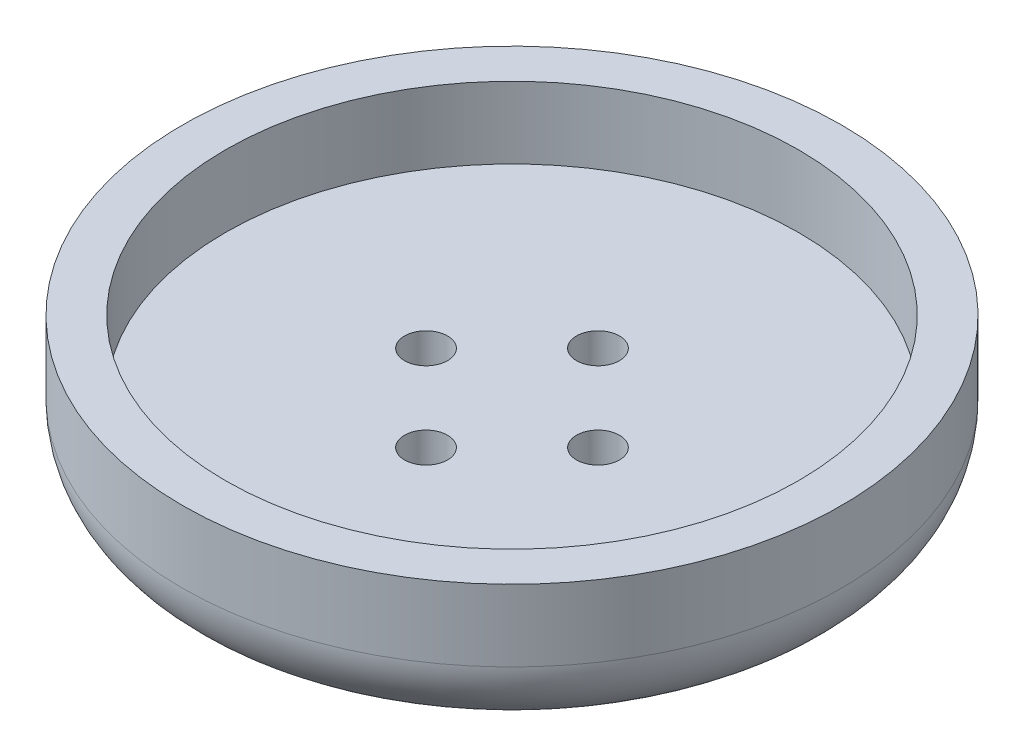
ISO-10303-21;
HEADER;
FILE_DESCRIPTION(('STEP AP214'),'2;1');
FILE_NAME('part.step','',(''),(''),'','','');
FILE_SCHEMA(('AUTOMOTIVE_DESIGN { 1 0 10303 214 1 1 1 1 }'));
ENDSEC;
DATA;
#1=APPLICATION_CONTEXT('core data for automotive mechanical design processes');
#2=APPLICATION_PROTOCOL_DEFINITION('international standard','automotive_design',2000,#1);
#3=PRODUCT_CONTEXT('',#1,'mechanical');
#4=PRODUCT('Part','Part','',(#3));
#5=PRODUCT_RELATED_PRODUCT_CATEGORY('part','',(#4));
#6=PRODUCT_DEFINITION_FORMATION('','',#4);
#7=PRODUCT_DEFINITION_CONTEXT('part definition',#1,'design');
#8=PRODUCT_DEFINITION('design','',#6,#7);
#9=PRODUCT_DEFINITION_SHAPE('','',#8);
#10=(LENGTH_UNIT() NAMED_UNIT(*) SI_UNIT(.MILLI.,.METRE.));
#11=(NAMED_UNIT(*) PLANE_ANGLE_UNIT() SI_UNIT($,.RADIAN.));
#12=(NAMED_UNIT(*) SI_UNIT($,.STERADIAN.) SOLID_ANGLE_UNIT());
#13=UNCERTAINTY_MEASURE_WITH_UNIT(LENGTH_MEASURE(1.E-05),#10,'distance_accuracy_value','');
#14=(GEOMETRIC_REPRESENTATION_CONTEXT(3) GLOBAL_UNCERTAINTY_ASSIGNED_CONTEXT((#13)) GLOBAL_UNIT_ASSIGNED_CONTEXT((#10,
#11,#12)) REPRESENTATION_CONTEXT('',''));
#15=CARTESIAN_POINT('',(0.,0.,0.));
#16=DIRECTION('',(0.,0.,1.));
#17=DIRECTION('',(1.,0.,0.));
#18=AXIS2_PLACEMENT_3D('',#15,#16,#17);
#19=CARTESIAN_POINT('',(0.,0.,0.));
#20=DIRECTION('',(0.,1.,0.));
#21=DIRECTION('',(0.,0.,1.));
#22=AXIS2_PLACEMENT_3D('',#19,#20,#21);
#23=PLANE('',#22);
#24=CARTESIAN_POINT('',(0.,0.,0.));
#25=DIRECTION('',(0.,1.,0.));
#26=DIRECTION('',(0.,0.,1.));
#27=AXIS2_PLACEMENT_3D('',#24,#25,#26);
#28=CIRCLE('',#27,18.);
#29=CARTESIAN_POINT('',(0.,0.,18.));
#30=VERTEX_POINT('',#29);
#31=EDGE_CURVE('E10',#30,#30,#28,.F.);
#32=ORIENTED_EDGE('',*,*,#31,.T.);
#33=EDGE_LOOP('',(#32));
#34=FACE_BOUND('',#33,.T.);
#35=CARTESIAN_POINT('',(0.,0.,6.));
#36=DIRECTION('',(0.,1.,0.));
#37=DIRECTION('',(0.,0.,1.));
#38=AXIS2_PLACEMENT_3D('',#35,#36,#37);
#39=CIRCLE('',#38,1.5);
#40=CARTESIAN_POINT('',(0.,0.,7.5));
#41=VERTEX_POINT('',#40);
#42=EDGE_CURVE('E56',#41,#41,#39,.T.);
#43=ORIENTED_EDGE('',*,*,#42,.T.);
#44=EDGE_LOOP('',(#43));
#45=FACE_BOUND('',#44,.T.);
#46=CARTESIAN_POINT('',(0.,0.,-6.));
#47=DIRECTION('',(0.,1.,0.));
#48=DIRECTION('',(0.,0.,1.));
#49=AXIS2_PLACEMENT_3D('',#46,#47,#48);
#50=CIRCLE('',#49,1.5);
#51=CARTESIAN_POINT('',(0.,0.,-4.5));
#52=VERTEX_POINT('',#51);
#53=EDGE_CURVE('E50',#52,#52,#50,.T.);
#54=ORIENTED_EDGE('',*,*,#53,.T.);
#55=EDGE_LOOP('',(#54));
#56=FACE_BOUND('',#55,.T.);
#57=CARTESIAN_POINT('',(-6.,0.,0.));
#58=DIRECTION('',(0.,1.,0.));
#59=DIRECTION('',(0.,0.,1.));
#60=AXIS2_PLACEMENT_3D('',#57,#58,#59);
#61=CIRCLE('',#60,1.5);
#62=CARTESIAN_POINT('',(-6.,0.,1.50000000000002));
#63=VERTEX_POINT('',#62);
#64=EDGE_CURVE('E47',#63,#63,#61,.T.);
#65=ORIENTED_EDGE('',*,*,#64,.T.);
#66=EDGE_LOOP('',(#65));
#67=FACE_BOUND('',#66,.T.);
#68=CARTESIAN_POINT('',(6.,0.,0.));
#69=DIRECTION('',(0.,1.,0.));
#70=DIRECTION('',(0.,0.,1.));
#71=AXIS2_PLACEMENT_3D('',#68,#69,#70);
#72=CIRCLE('',#71,1.5);
#73=CARTESIAN_POINT('',(6.,0.,1.50000000000002));
#74=VERTEX_POINT('',#73);
#75=EDGE_CURVE('E53',#74,#74,#72,.T.);
#76=ORIENTED_EDGE('',*,*,#75,.T.);
#77=EDGE_LOOP('',(#76));
#78=FACE_BOUND('',#77,.T.);
#79=CARTESIAN_POINT('',(0.,0.,0.));
#80=DIRECTION('',(0.,1.,0.));
#81=DIRECTION('',(0.,0.,1.));
#82=AXIS2_PLACEMENT_3D('',#79,#80,#81);
#83=CIRCLE('',#82,2.);
#84=CARTESIAN_POINT('',(0.,0.,2.));
#85=VERTEX_POINT('',#84);
#86=EDGE_CURVE('E42',#85,#85,#83,.F.);
#87=ORIENTED_EDGE('',*,*,#86,.F.);
#88=EDGE_LOOP('',(#87));
#89=FACE_BOUND('',#88,.T.);
#90=ADVANCED_FACE('F30',(#34,#45,#56,#67,#78,#89),#23,.F.);
#91=CARTESIAN_POINT('',(0.,25.,0.));
#92=DIRECTION('',(0.,-1.,0.));
#93=DIRECTION('',(0.,0.,-1.));
#94=AXIS2_PLACEMENT_3D('',#91,#92,#93);
#95=CYLINDRICAL_SURFACE('',#94,23.);
#96=CARTESIAN_POINT('',(0.,10.,0.));
#97=DIRECTION('',(0.,-1.,0.));
#98=DIRECTION('',(0.,0.,-1.));
#99=AXIS2_PLACEMENT_3D('',#96,#97,#98);
#100=CIRCLE('',#99,23.);
#101=CARTESIAN_POINT('',(0.,10.,-23.));
#102=VERTEX_POINT('',#101);
#103=EDGE_CURVE('E34',#102,#102,#100,.T.);
#104=ORIENTED_EDGE('',*,*,#103,.T.);
#105=EDGE_LOOP('',(#104));
#106=FACE_BOUND('',#105,.T.);
#107=CARTESIAN_POINT('',(0.,5.,0.));
#108=DIRECTION('',(0.,1.,0.));
#109=DIRECTION('',(0.,0.,1.));
#110=AXIS2_PLACEMENT_3D('',#107,#108,#109);
#111=CIRCLE('',#110,23.);
#112=CARTESIAN_POINT('',(0.,5.,23.));
#113=VERTEX_POINT('',#112);
#114=EDGE_CURVE('E38',#113,#113,#111,.T.);
#115=ORIENTED_EDGE('',*,*,#114,.T.);
#116=EDGE_LOOP('',(#115));
#117=FACE_BOUND('',#116,.T.);
#118=ADVANCED_FACE('F96',(#106,#117),#95,.T.);
#119=CARTESIAN_POINT('',(-6.,5.,0.));
#120=DIRECTION('',(0.,-1.,0.));
#121=DIRECTION('',(0.,0.,-1.));
#122=AXIS2_PLACEMENT_3D('',#119,#120,#121);
#123=CYLINDRICAL_SURFACE('',#122,1.5);
#124=CARTESIAN_POINT('',(-6.,5.,0.));
#125=DIRECTION('',(0.,1.,0.));
#126=DIRECTION('',(0.,0.,1.));
#127=AXIS2_PLACEMENT_3D('',#124,#125,#126);
#128=CIRCLE('',#127,1.5);
#129=CARTESIAN_POINT('',(-6.,5.,1.50000000000002));
#130=VERTEX_POINT('',#129);
#131=EDGE_CURVE('E62',#130,#130,#128,.T.);
#132=ORIENTED_EDGE('',*,*,#131,.T.);
#133=EDGE_LOOP('',(#132));
#134=FACE_BOUND('',#133,.T.);
#135=ORIENTED_EDGE('',*,*,#64,.F.);
#136=EDGE_LOOP('',(#135));
#137=FACE_BOUND('',#136,.T.);
#138=ADVANCED_FACE('F99',(#134,#137),#123,.F.);
#139=CARTESIAN_POINT('',(0.,5.,-6.));
#140=DIRECTION('',(0.,-1.,0.));
#141=DIRECTION('',(0.,0.,-1.));
#142=AXIS2_PLACEMENT_3D('',#139,#140,#141);
#143=CYLINDRICAL_SURFACE('',#142,1.5);
#144=CARTESIAN_POINT('',(0.,5.,-6.));
#145=DIRECTION('',(0.,1.,0.));
#146=DIRECTION('',(0.,0.,1.));
#147=AXIS2_PLACEMENT_3D('',#144,#145,#146);
#148=CIRCLE('',#147,1.5);
#149=CARTESIAN_POINT('',(0.,5.,-4.5));
#150=VERTEX_POINT('',#149);
#151=EDGE_CURVE('E65',#150,#150,#148,.T.);
#152=ORIENTED_EDGE('',*,*,#151,.T.);
#153=EDGE_LOOP('',(#152));
#154=FACE_BOUND('',#153,.T.);
#155=ORIENTED_EDGE('',*,*,#53,.F.);
#156=EDGE_LOOP('',(#155));
#157=FACE_BOUND('',#156,.T.);
#158=ADVANCED_FACE('F119',(#154,#157),#143,.F.);
#159=CARTESIAN_POINT('',(6.,5.,0.));
#160=DIRECTION('',(0.,-1.,0.));
#161=DIRECTION('',(0.,0.,-1.));
#162=AXIS2_PLACEMENT_3D('',#159,#160,#161);
#163=CYLINDRICAL_SURFACE('',#162,1.5);
#164=CARTESIAN_POINT('',(6.,5.,0.));
#165=DIRECTION('',(0.,1.,0.));
#166=DIRECTION('',(0.,0.,1.));
#167=AXIS2_PLACEMENT_3D('',#164,#165,#166);
#168=CIRCLE('',#167,1.5);
#169=CARTESIAN_POINT('',(6.,5.,1.50000000000002));
#170=VERTEX_POINT('',#169);
#171=EDGE_CURVE('E68',#170,#170,#168,.T.);
#172=ORIENTED_EDGE('',*,*,#171,.T.);
#173=EDGE_LOOP('',(#172));
#174=FACE_BOUND('',#173,.T.);
#175=ORIENTED_EDGE('',*,*,#75,.F.);
#176=EDGE_LOOP('',(#175));
#177=FACE_BOUND('',#176,.T.);
#178=ADVANCED_FACE('F123',(#174,#177),#163,.F.);
#179=CARTESIAN_POINT('',(0.,5.,6.));
#180=DIRECTION('',(0.,-1.,0.));
#181=DIRECTION('',(0.,0.,-1.));
#182=AXIS2_PLACEMENT_3D('',#179,#180,#181);
#183=CYLINDRICAL_SURFACE('',#182,1.5);
#184=CARTESIAN_POINT('',(0.,5.,6.));
#185=DIRECTION('',(0.,1.,0.));
#186=DIRECTION('',(0.,0.,1.));
#187=AXIS2_PLACEMENT_3D('',#184,#185,#186);
#188=CIRCLE('',#187,1.5);
#189=CARTESIAN_POINT('',(0.,5.,7.5));
#190=VERTEX_POINT('',#189);
#191=EDGE_CURVE('E71',#190,#190,#188,.T.);
#192=ORIENTED_EDGE('',*,*,#191,.T.);
#193=EDGE_LOOP('',(#192));
#194=FACE_BOUND('',#193,.T.);
#195=ORIENTED_EDGE('',*,*,#42,.F.);
#196=EDGE_LOOP('',(#195));
#197=FACE_BOUND('',#196,.T.);
#198=ADVANCED_FACE('F127',(#194,#197),#183,.F.);
#199=CARTESIAN_POINT('',(0.,-3.,0.));
#200=DIRECTION('',(0.,1.,0.));
#201=DIRECTION('',(0.,0.,1.));
#202=AXIS2_PLACEMENT_3D('',#199,#200,#201);
#203=CYLINDRICAL_SURFACE('',#202,2.);
#204=CARTESIAN_POINT('',(0.,-3.,0.));
#205=DIRECTION('',(0.,-1.,0.));
#206=DIRECTION('',(0.,0.,-1.));
#207=AXIS2_PLACEMENT_3D('',#204,#205,#206);
#208=CIRCLE('',#207,2.);
#209=CARTESIAN_POINT('',(0.,-3.,-2.));
#210=VERTEX_POINT('',#209);
#211=EDGE_CURVE('E59',#210,#210,#208,.T.);
#212=ORIENTED_EDGE('',*,*,#211,.F.);
#213=EDGE_LOOP('',(#212));
#214=FACE_BOUND('',#213,.T.);
#215=ORIENTED_EDGE('',*,*,#86,.T.);
#216=EDGE_LOOP('',(#215));
#217=FACE_BOUND('',#216,.T.);
#218=ADVANCED_FACE('F108',(#214,#217),#203,.T.);
#219=CARTESIAN_POINT('',(0.,-3.,0.));
#220=DIRECTION('',(0.,-1.,0.));
#221=DIRECTION('',(0.,0.,-1.));
#222=AXIS2_PLACEMENT_3D('',#219,#220,#221);
#223=PLANE('',#222);
#224=ORIENTED_EDGE('',*,*,#211,.T.);
#225=EDGE_LOOP('',(#224));
#226=FACE_BOUND('',#225,.T.);
#227=ADVANCED_FACE('F103',(#226),#223,.T.);
#228=CARTESIAN_POINT('',(0.,5.,0.));
#229=DIRECTION('',(0.,1.,0.));
#230=DIRECTION('',(0.,0.,1.));
#231=AXIS2_PLACEMENT_3D('',#228,#229,#230);
#232=TOROIDAL_SURFACE('',#231,18.,5.);
#233=ORIENTED_EDGE('',*,*,#31,.F.);
#234=EDGE_LOOP('',(#233));
#235=FACE_BOUND('',#234,.T.);
#236=ORIENTED_EDGE('',*,*,#114,.F.);
#237=EDGE_LOOP('',(#236));
#238=FACE_BOUND('',#237,.T.);
#239=ADVANCED_FACE('F32',(#235,#238),#232,.T.);
#240=CARTESIAN_POINT('',(-50.,10.,28.3907220814146));
#241=DIRECTION('',(0.,-1.,0.));
#242=DIRECTION('',(0.,0.,-1.));
#243=AXIS2_PLACEMENT_3D('',#240,#241,#242);
#244=PLANE('',#243);
#245=CARTESIAN_POINT('',(0.,10.,0.));
#246=DIRECTION('',(0.,1.,0.));
#247=DIRECTION('',(0.,0.,1.));
#248=AXIS2_PLACEMENT_3D('',#245,#246,#247);
#249=CIRCLE('',#248,20.);
#250=CARTESIAN_POINT('',(0.,10.,20.));
#251=VERTEX_POINT('',#250);
#252=EDGE_CURVE('E75',#251,#251,#249,.T.);
#253=ORIENTED_EDGE('',*,*,#252,.F.);
#254=EDGE_LOOP('',(#253));
#255=FACE_BOUND('',#254,.T.);
#256=ORIENTED_EDGE('',*,*,#103,.F.);
#257=EDGE_LOOP('',(#256));
#258=FACE_BOUND('',#257,.T.);
#259=ADVANCED_FACE('F86',(#255,#258),#244,.F.);
#260=CARTESIAN_POINT('',(0.,5.,0.));
#261=DIRECTION('',(0.,1.,0.));
#262=DIRECTION('',(0.,0.,1.));
#263=AXIS2_PLACEMENT_3D('',#260,#261,#262);
#264=CYLINDRICAL_SURFACE('',#263,20.);
#265=CARTESIAN_POINT('',(0.,5.,0.));
#266=DIRECTION('',(0.,1.,0.));
#267=DIRECTION('',(0.,0.,1.));
#268=AXIS2_PLACEMENT_3D('',#265,#266,#267);
#269=CIRCLE('',#268,20.);
#270=CARTESIAN_POINT('',(0.,5.,20.));
#271=VERTEX_POINT('',#270);
#272=EDGE_CURVE('E74',#271,#271,#269,.T.);
#273=ORIENTED_EDGE('',*,*,#272,.F.);
#274=EDGE_LOOP('',(#273));
#275=FACE_BOUND('',#274,.T.);
#276=ORIENTED_EDGE('',*,*,#252,.T.);
#277=EDGE_LOOP('',(#276));
#278=FACE_BOUND('',#277,.T.);
#279=ADVANCED_FACE('F83',(#275,#278),#264,.F.);
#280=CARTESIAN_POINT('',(0.,5.,0.));
#281=DIRECTION('',(0.,1.,0.));
#282=DIRECTION('',(0.,0.,1.));
#283=AXIS2_PLACEMENT_3D('',#280,#281,#282);
#284=PLANE('',#283);
#285=ORIENTED_EDGE('',*,*,#131,.F.);
#286=EDGE_LOOP('',(#285));
#287=FACE_BOUND('',#286,.T.);
#288=ORIENTED_EDGE('',*,*,#151,.F.);
#289=EDGE_LOOP('',(#288));
#290=FACE_BOUND('',#289,.T.);
#291=ORIENTED_EDGE('',*,*,#171,.F.);
#292=EDGE_LOOP('',(#291));
#293=FACE_BOUND('',#292,.T.);
#294=ORIENTED_EDGE('',*,*,#191,.F.);
#295=EDGE_LOOP('',(#294));
#296=FACE_BOUND('',#295,.T.);
#297=ORIENTED_EDGE('',*,*,#272,.T.);
#298=EDGE_LOOP('',(#297));
#299=FACE_BOUND('',#298,.T.);
#300=ADVANCED_FACE('F81',(#287,#290,#293,#296,#299),#284,.T.);
#301=CLOSED_SHELL('',(#90,#118,#138,#158,#178,#198,#218,#227,#239,#259,#279,#300));
#302=MANIFOLD_SOLID_BREP('B2',#301);
#303=ADVANCED_BREP_SHAPE_REPRESENTATION('',(#18,#302),#14);
#304=SHAPE_DEFINITION_REPRESENTATION(#9,#303);
ENDSEC;
END-ISO-10303-21;
